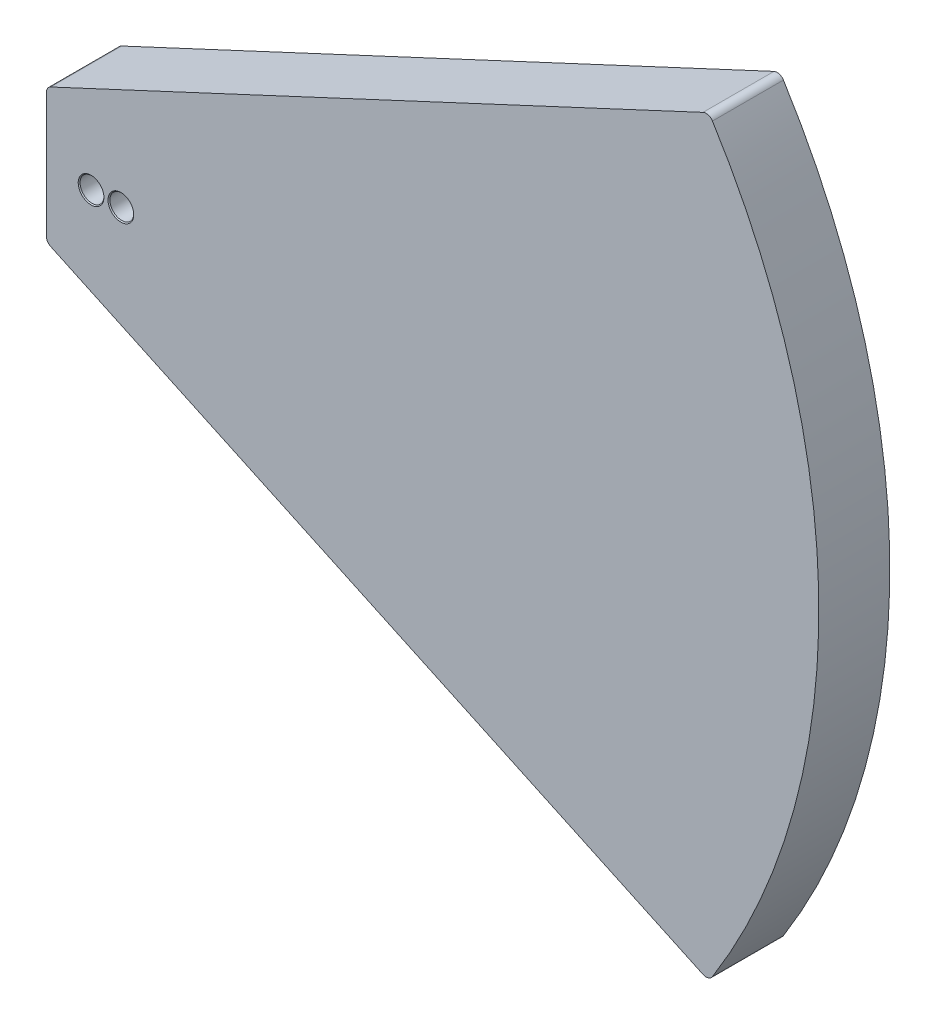
ISO-10303-21;
HEADER;
FILE_DESCRIPTION(('STEP AP214'),'2;1');
FILE_NAME('part.step','',(''),(''),'','','');
FILE_SCHEMA(('AUTOMOTIVE_DESIGN { 1 0 10303 214 1 1 1 1 }'));
ENDSEC;
DATA;
#1=APPLICATION_CONTEXT('core data for automotive mechanical design processes');
#2=APPLICATION_PROTOCOL_DEFINITION('international standard','automotive_design',2000,#1);
#3=PRODUCT_CONTEXT('',#1,'mechanical');
#4=PRODUCT('Part','Part','',(#3));
#5=PRODUCT_RELATED_PRODUCT_CATEGORY('part','',(#4));
#6=PRODUCT_DEFINITION_FORMATION('','',#4);
#7=PRODUCT_DEFINITION_CONTEXT('part definition',#1,'design');
#8=PRODUCT_DEFINITION('design','',#6,#7);
#9=PRODUCT_DEFINITION_SHAPE('','',#8);
#10=(LENGTH_UNIT() NAMED_UNIT(*) SI_UNIT(.MILLI.,.METRE.));
#11=(NAMED_UNIT(*) PLANE_ANGLE_UNIT() SI_UNIT($,.RADIAN.));
#12=(NAMED_UNIT(*) SI_UNIT($,.STERADIAN.) SOLID_ANGLE_UNIT());
#13=UNCERTAINTY_MEASURE_WITH_UNIT(LENGTH_MEASURE(1.E-05),#10,'distance_accuracy_value','');
#14=(GEOMETRIC_REPRESENTATION_CONTEXT(3) GLOBAL_UNCERTAINTY_ASSIGNED_CONTEXT((#13)) GLOBAL_UNIT_ASSIGNED_CONTEXT((#10,
#11,#12)) REPRESENTATION_CONTEXT('',''));
#15=CARTESIAN_POINT('',(0.,0.,0.));
#16=DIRECTION('',(0.,0.,1.));
#17=DIRECTION('',(1.,0.,0.));
#18=AXIS2_PLACEMENT_3D('',#15,#16,#17);
#19=CARTESIAN_POINT('',(0.,0.,0.));
#20=DIRECTION('',(0.,0.,1.));
#21=DIRECTION('',(1.,0.,0.));
#22=AXIS2_PLACEMENT_3D('',#19,#20,#21);
#23=PLANE('',#22);
#24=DIRECTION('',(0.,-1.,0.));
#25=VECTOR('',#24,1.);
#26=CARTESIAN_POINT('',(-10.,-9.,0.));
#27=LINE('',#26,#25);
#28=CARTESIAN_POINT('',(-10.,-5.5,0.));
#29=VERTEX_POINT('',#28);
#30=CARTESIAN_POINT('',(-10.,-8.36292973919251,0.));
#31=VERTEX_POINT('',#30);
#32=EDGE_CURVE('E198',#29,#31,#27,.T.);
#33=ORIENTED_EDGE('',*,*,#32,.F.);
#34=CARTESIAN_POINT('',(-9.,-5.5,0.));
#35=DIRECTION('',(0.,0.,1.));
#36=DIRECTION('',(1.,0.,0.));
#37=AXIS2_PLACEMENT_3D('',#34,#35,#36);
#38=CIRCLE('',#37,1.);
#39=CARTESIAN_POINT('',(-9.,-4.5,0.));
#40=VERTEX_POINT('',#39);
#41=EDGE_CURVE('E230',#29,#40,#38,.F.);
#42=ORIENTED_EDGE('',*,*,#41,.T.);
#43=DIRECTION('',(-1.,0.,0.));
#44=VECTOR('',#43,1.);
#45=CARTESIAN_POINT('',(0.,-4.5,0.));
#46=LINE('',#45,#44);
#47=CARTESIAN_POINT('',(0.,-4.5,0.));
#48=VERTEX_POINT('',#47);
#49=EDGE_CURVE('E150',#48,#40,#46,.T.);
#50=ORIENTED_EDGE('',*,*,#49,.F.);
#51=CARTESIAN_POINT('',(0.,0.,0.));
#52=DIRECTION('',(0.,0.,-1.));
#53=DIRECTION('',(-1.,0.,0.));
#54=AXIS2_PLACEMENT_3D('',#51,#52,#53);
#55=CIRCLE('',#54,4.5);
#56=CARTESIAN_POINT('',(0.,4.5,0.));
#57=VERTEX_POINT('',#56);
#58=EDGE_CURVE('E166',#57,#48,#55,.T.);
#59=ORIENTED_EDGE('',*,*,#58,.F.);
#60=DIRECTION('',(1.,0.,0.));
#61=VECTOR('',#60,1.);
#62=CARTESIAN_POINT('',(-10.,4.5,0.));
#63=LINE('',#62,#61);
#64=CARTESIAN_POINT('',(-9.,4.5,0.));
#65=VERTEX_POINT('',#64);
#66=EDGE_CURVE('E153',#65,#57,#63,.T.);
#67=ORIENTED_EDGE('',*,*,#66,.F.);
#68=CARTESIAN_POINT('',(-9.,5.5,0.));
#69=DIRECTION('',(0.,0.,1.));
#70=DIRECTION('',(1.,0.,0.));
#71=AXIS2_PLACEMENT_3D('',#68,#69,#70);
#72=CIRCLE('',#71,1.);
#73=CARTESIAN_POINT('',(-10.,5.5,0.));
#74=VERTEX_POINT('',#73);
#75=EDGE_CURVE('E218',#65,#74,#72,.F.);
#76=ORIENTED_EDGE('',*,*,#75,.T.);
#77=CARTESIAN_POINT('',(-10.,8.3629297391925,0.));
#78=VERTEX_POINT('',#77);
#79=EDGE_CURVE('E179',#78,#74,#27,.T.);
#80=ORIENTED_EDGE('',*,*,#79,.F.);
#81=CARTESIAN_POINT('',(-9.,8.3629297391925,0.));
#82=DIRECTION('',(0.,0.,1.));
#83=DIRECTION('',(1.,0.,0.));
#84=AXIS2_PLACEMENT_3D('',#81,#82,#83);
#85=CIRCLE('',#84,1.);
#86=CARTESIAN_POINT('',(-9.4226182617407,9.26923752622916,0.));
#87=VERTEX_POINT('',#86);
#88=EDGE_CURVE('E222',#78,#87,#85,.F.);
#89=ORIENTED_EDGE('',*,*,#88,.T.);
#90=DIRECTION('',(-0.906307787036649,-0.4226182617407,0.));
#91=VECTOR('',#90,1.);
#92=CARTESIAN_POINT('',(-10.,9.,0.));
#93=LINE('',#92,#91);
#94=CARTESIAN_POINT('',(78.1027823170481,50.0830020992024,0.));
#95=VERTEX_POINT('',#94);
#96=EDGE_CURVE('E192',#95,#87,#93,.T.);
#97=ORIENTED_EDGE('',*,*,#96,.F.);
#98=CARTESIAN_POINT('',(78.5254005787888,49.1766943121658,0.));
#99=DIRECTION('',(0.,0.,1.));
#100=DIRECTION('',(1.,0.,0.));
#101=AXIS2_PLACEMENT_3D('',#98,#99,#100);
#102=CIRCLE('',#101,1.);
#103=CARTESIAN_POINT('',(79.3729216172575,49.7074561131207,0.));
#104=VERTEX_POINT('',#103);
#105=EDGE_CURVE('E224',#95,#104,#102,.F.);
#106=ORIENTED_EDGE('',*,*,#105,.T.);
#107=CARTESIAN_POINT('',(0.,0.,0.));
#108=DIRECTION('',(0.,0.,1.));
#109=DIRECTION('',(1.,0.,0.));
#110=AXIS2_PLACEMENT_3D('',#107,#108,#109);
#111=CIRCLE('',#110,93.6530398828416);
#112=CARTESIAN_POINT('',(79.3729216172575,-49.7074561131207,0.));
#113=VERTEX_POINT('',#112);
#114=EDGE_CURVE('E191',#113,#104,#111,.T.);
#115=ORIENTED_EDGE('',*,*,#114,.F.);
#116=CARTESIAN_POINT('',(78.5254005787888,-49.1766943121658,0.));
#117=DIRECTION('',(0.,0.,1.));
#118=DIRECTION('',(1.,0.,0.));
#119=AXIS2_PLACEMENT_3D('',#116,#117,#118);
#120=CIRCLE('',#119,1.);
#121=CARTESIAN_POINT('',(78.1027823170481,-50.0830020992024,0.));
#122=VERTEX_POINT('',#121);
#123=EDGE_CURVE('E220',#113,#122,#120,.F.);
#124=ORIENTED_EDGE('',*,*,#123,.T.);
#125=DIRECTION('',(0.906307787036649,-0.4226182617407,0.));
#126=VECTOR('',#125,1.);
#127=CARTESIAN_POINT('',(-10.,-9.,0.));
#128=LINE('',#127,#126);
#129=CARTESIAN_POINT('',(-9.4226182617407,-9.26923752622916,0.));
#130=VERTEX_POINT('',#129);
#131=EDGE_CURVE('E174',#130,#122,#128,.T.);
#132=ORIENTED_EDGE('',*,*,#131,.F.);
#133=CARTESIAN_POINT('',(-9.,-8.36292973919251,0.));
#134=DIRECTION('',(0.,0.,1.));
#135=DIRECTION('',(1.,0.,0.));
#136=AXIS2_PLACEMENT_3D('',#133,#134,#135);
#137=CIRCLE('',#136,1.);
#138=EDGE_CURVE('E223',#130,#31,#137,.F.);
#139=ORIENTED_EDGE('',*,*,#138,.T.);
#140=EDGE_LOOP('',(#33,#42,#50,#59,#67,#76,#80,#89,#97,#106,#115,#124,#132,#139));
#141=FACE_BOUND('',#140,.T.);
#142=ADVANCED_FACE('F39',(#141),#23,.F.);
#143=CARTESIAN_POINT('',(-10.,-9.,9.525));
#144=DIRECTION('',(0.4226182617407,0.90630778703665,0.));
#145=DIRECTION('',(-0.906307787036649,0.4226182617407,0.));
#146=AXIS2_PLACEMENT_3D('',#143,#144,#145);
#147=PLANE('',#146);
#148=DIRECTION('',(0.906307787036649,-0.4226182617407,0.));
#149=VECTOR('',#148,1.);
#150=CARTESIAN_POINT('',(-10.,-9.,9.525));
#151=LINE('',#150,#149);
#152=CARTESIAN_POINT('',(-9.4226182617407,-9.26923752622916,9.525));
#153=VERTEX_POINT('',#152);
#154=CARTESIAN_POINT('',(78.1027823170481,-50.0830020992024,9.525));
#155=VERTEX_POINT('',#154);
#156=EDGE_CURVE('E176',#153,#155,#151,.T.);
#157=ORIENTED_EDGE('',*,*,#156,.F.);
#158=DIRECTION('',(0.,0.,-1.));
#159=VECTOR('',#158,1.);
#160=CARTESIAN_POINT('',(-9.4226182617407,-9.26923752622916,9.525));
#161=LINE('',#160,#159);
#162=EDGE_CURVE('E233',#153,#130,#161,.T.);
#163=ORIENTED_EDGE('',*,*,#162,.T.);
#164=ORIENTED_EDGE('',*,*,#131,.T.);
#165=DIRECTION('',(0.,0.,-1.));
#166=VECTOR('',#165,1.);
#167=CARTESIAN_POINT('',(78.1027823170481,-50.0830020992024,9.525));
#168=LINE('',#167,#166);
#169=EDGE_CURVE('E231',#122,#155,#168,.F.);
#170=ORIENTED_EDGE('',*,*,#169,.T.);
#171=EDGE_LOOP('',(#157,#163,#164,#170));
#172=FACE_BOUND('',#171,.T.);
#173=ADVANCED_FACE('F273',(#172),#147,.F.);
#174=CARTESIAN_POINT('',(0.,0.,9.525));
#175=DIRECTION('',(0.,0.,-1.));
#176=DIRECTION('',(-1.,0.,0.));
#177=AXIS2_PLACEMENT_3D('',#174,#175,#176);
#178=CYLINDRICAL_SURFACE('',#177,93.6530398828416);
#179=ORIENTED_EDGE('',*,*,#114,.T.);
#180=DIRECTION('',(0.,0.,-1.));
#181=VECTOR('',#180,1.);
#182=CARTESIAN_POINT('',(79.3729216172575,49.7074561131207,9.525));
#183=LINE('',#182,#181);
#184=CARTESIAN_POINT('',(79.3729216172575,49.7074561131207,9.525));
#185=VERTEX_POINT('',#184);
#186=EDGE_CURVE('E253',#104,#185,#183,.F.);
#187=ORIENTED_EDGE('',*,*,#186,.T.);
#188=CARTESIAN_POINT('',(0.,0.,9.525));
#189=DIRECTION('',(0.,0.,1.));
#190=DIRECTION('',(1.,0.,0.));
#191=AXIS2_PLACEMENT_3D('',#188,#189,#190);
#192=CIRCLE('',#191,93.6530398828416);
#193=CARTESIAN_POINT('',(79.3729216172575,-49.7074561131207,9.525));
#194=VERTEX_POINT('',#193);
#195=EDGE_CURVE('E177',#194,#185,#192,.T.);
#196=ORIENTED_EDGE('',*,*,#195,.F.);
#197=DIRECTION('',(0.,0.,-1.));
#198=VECTOR('',#197,1.);
#199=CARTESIAN_POINT('',(79.3729216172575,-49.7074561131207,9.525));
#200=LINE('',#199,#198);
#201=EDGE_CURVE('E248',#194,#113,#200,.T.);
#202=ORIENTED_EDGE('',*,*,#201,.T.);
#203=EDGE_LOOP('',(#179,#187,#196,#202));
#204=FACE_BOUND('',#203,.T.);
#205=ADVANCED_FACE('F284',(#204),#178,.T.);
#206=CARTESIAN_POINT('',(-10.,9.,9.525));
#207=DIRECTION('',(0.4226182617407,-0.90630778703665,0.));
#208=DIRECTION('',(0.906307787036649,0.4226182617407,0.));
#209=AXIS2_PLACEMENT_3D('',#206,#207,#208);
#210=PLANE('',#209);
#211=DIRECTION('',(-0.906307787036649,-0.4226182617407,0.));
#212=VECTOR('',#211,1.);
#213=CARTESIAN_POINT('',(-10.,9.,9.525));
#214=LINE('',#213,#212);
#215=CARTESIAN_POINT('',(78.1027823170481,50.0830020992024,9.525));
#216=VERTEX_POINT('',#215);
#217=CARTESIAN_POINT('',(-9.4226182617407,9.26923752622916,9.525));
#218=VERTEX_POINT('',#217);
#219=EDGE_CURVE('E181',#216,#218,#214,.T.);
#220=ORIENTED_EDGE('',*,*,#219,.F.);
#221=DIRECTION('',(0.,0.,-1.));
#222=VECTOR('',#221,1.);
#223=CARTESIAN_POINT('',(78.1027823170481,50.0830020992024,9.525));
#224=LINE('',#223,#222);
#225=EDGE_CURVE('E242',#216,#95,#224,.T.);
#226=ORIENTED_EDGE('',*,*,#225,.T.);
#227=ORIENTED_EDGE('',*,*,#96,.T.);
#228=DIRECTION('',(0.,0.,-1.));
#229=VECTOR('',#228,1.);
#230=CARTESIAN_POINT('',(-9.4226182617407,9.26923752622916,9.525));
#231=LINE('',#230,#229);
#232=EDGE_CURVE('E58',#87,#218,#231,.F.);
#233=ORIENTED_EDGE('',*,*,#232,.T.);
#234=EDGE_LOOP('',(#220,#226,#227,#233));
#235=FACE_BOUND('',#234,.T.);
#236=ADVANCED_FACE('F292',(#235),#210,.F.);
#237=CARTESIAN_POINT('',(-10.,-9.,9.525));
#238=DIRECTION('',(1.,0.,0.));
#239=DIRECTION('',(0.,0.,-1.));
#240=AXIS2_PLACEMENT_3D('',#237,#238,#239);
#241=PLANE('',#240);
#242=DIRECTION('',(0.,1.,0.));
#243=VECTOR('',#242,1.);
#244=CARTESIAN_POINT('',(-10.,4.5,4.));
#245=LINE('',#244,#243);
#246=CARTESIAN_POINT('',(-10.,-5.5,4.));
#247=VERTEX_POINT('',#246);
#248=CARTESIAN_POINT('',(-10.,5.5,4.));
#249=VERTEX_POINT('',#248);
#250=EDGE_CURVE('E158',#247,#249,#245,.T.);
#251=ORIENTED_EDGE('',*,*,#250,.F.);
#252=DIRECTION('',(0.,0.,-1.));
#253=VECTOR('',#252,1.);
#254=CARTESIAN_POINT('',(-10.,-5.5,9.525));
#255=LINE('',#254,#253);
#256=EDGE_CURVE('E212',#247,#29,#255,.T.);
#257=ORIENTED_EDGE('',*,*,#256,.T.);
#258=ORIENTED_EDGE('',*,*,#32,.T.);
#259=DIRECTION('',(0.,0.,-1.));
#260=VECTOR('',#259,1.);
#261=CARTESIAN_POINT('',(-10.,-8.36292973919251,9.525));
#262=LINE('',#261,#260);
#263=CARTESIAN_POINT('',(-10.,-8.36292973919251,9.525));
#264=VERTEX_POINT('',#263);
#265=EDGE_CURVE('E215',#31,#264,#262,.F.);
#266=ORIENTED_EDGE('',*,*,#265,.T.);
#267=DIRECTION('',(0.,-1.,0.));
#268=VECTOR('',#267,1.);
#269=CARTESIAN_POINT('',(-10.,-9.,9.525));
#270=LINE('',#269,#268);
#271=CARTESIAN_POINT('',(-10.,8.3629297391925,9.525));
#272=VERTEX_POINT('',#271);
#273=EDGE_CURVE('E183',#272,#264,#270,.T.);
#274=ORIENTED_EDGE('',*,*,#273,.F.);
#275=DIRECTION('',(0.,0.,-1.));
#276=VECTOR('',#275,1.);
#277=CARTESIAN_POINT('',(-10.,8.3629297391925,9.525));
#278=LINE('',#277,#276);
#279=EDGE_CURVE('E207',#272,#78,#278,.T.);
#280=ORIENTED_EDGE('',*,*,#279,.T.);
#281=ORIENTED_EDGE('',*,*,#79,.T.);
#282=DIRECTION('',(0.,0.,-1.));
#283=VECTOR('',#282,1.);
#284=CARTESIAN_POINT('',(-10.,5.5,9.525));
#285=LINE('',#284,#283);
#286=EDGE_CURVE('E186',#74,#249,#285,.F.);
#287=ORIENTED_EDGE('',*,*,#286,.T.);
#288=EDGE_LOOP('',(#251,#257,#258,#266,#274,#280,#281,#287));
#289=FACE_BOUND('',#288,.T.);
#290=ADVANCED_FACE('F263',(#289),#241,.F.);
#291=CARTESIAN_POINT('',(0.,0.,9.525));
#292=DIRECTION('',(0.,0.,1.));
#293=DIRECTION('',(1.,0.,0.));
#294=AXIS2_PLACEMENT_3D('',#291,#292,#293);
#295=PLANE('',#294);
#296=CARTESIAN_POINT('',(0.,0.,9.525));
#297=DIRECTION('',(0.,0.,1.));
#298=DIRECTION('',(1.,0.,0.));
#299=AXIS2_PLACEMENT_3D('',#296,#297,#298);
#300=CIRCLE('',#299,1.725);
#301=CARTESIAN_POINT('',(1.725,0.,9.525));
#302=VERTEX_POINT('',#301);
#303=EDGE_CURVE('E467',#302,#302,#300,.T.);
#304=ORIENTED_EDGE('',*,*,#303,.F.);
#305=EDGE_LOOP('',(#304));
#306=FACE_BOUND('',#305,.T.);
#307=CARTESIAN_POINT('',(-4.,0.,9.525));
#308=DIRECTION('',(0.,0.,1.));
#309=DIRECTION('',(1.,0.,0.));
#310=AXIS2_PLACEMENT_3D('',#307,#308,#309);
#311=CIRCLE('',#310,1.725);
#312=CARTESIAN_POINT('',(-2.275,0.,9.525));
#313=VERTEX_POINT('',#312);
#314=EDGE_CURVE('E202',#313,#313,#311,.T.);
#315=ORIENTED_EDGE('',*,*,#314,.F.);
#316=EDGE_LOOP('',(#315));
#317=FACE_BOUND('',#316,.T.);
#318=ORIENTED_EDGE('',*,*,#273,.T.);
#319=CARTESIAN_POINT('',(-9.,-8.36292973919251,9.525));
#320=DIRECTION('',(0.,0.,1.));
#321=DIRECTION('',(1.,0.,0.));
#322=AXIS2_PLACEMENT_3D('',#319,#320,#321);
#323=CIRCLE('',#322,1.);
#324=EDGE_CURVE('E245',#264,#153,#323,.T.);
#325=ORIENTED_EDGE('',*,*,#324,.T.);
#326=ORIENTED_EDGE('',*,*,#156,.T.);
#327=CARTESIAN_POINT('',(78.5254005787888,-49.1766943121658,9.525));
#328=DIRECTION('',(0.,0.,1.));
#329=DIRECTION('',(1.,0.,0.));
#330=AXIS2_PLACEMENT_3D('',#327,#328,#329);
#331=CIRCLE('',#330,1.);
#332=EDGE_CURVE('E237',#155,#194,#331,.T.);
#333=ORIENTED_EDGE('',*,*,#332,.T.);
#334=ORIENTED_EDGE('',*,*,#195,.T.);
#335=CARTESIAN_POINT('',(78.5254005787888,49.1766943121658,9.525));
#336=DIRECTION('',(0.,0.,1.));
#337=DIRECTION('',(1.,0.,0.));
#338=AXIS2_PLACEMENT_3D('',#335,#336,#337);
#339=CIRCLE('',#338,1.);
#340=EDGE_CURVE('E238',#185,#216,#339,.T.);
#341=ORIENTED_EDGE('',*,*,#340,.T.);
#342=ORIENTED_EDGE('',*,*,#219,.T.);
#343=CARTESIAN_POINT('',(-9.,8.3629297391925,9.525));
#344=DIRECTION('',(0.,0.,1.));
#345=DIRECTION('',(1.,0.,0.));
#346=AXIS2_PLACEMENT_3D('',#343,#344,#345);
#347=CIRCLE('',#346,1.);
#348=EDGE_CURVE('E236',#218,#272,#347,.T.);
#349=ORIENTED_EDGE('',*,*,#348,.T.);
#350=EDGE_LOOP('',(#318,#325,#326,#333,#334,#341,#342,#349));
#351=FACE_BOUND('',#350,.T.);
#352=ADVANCED_FACE('F279',(#306,#317,#351),#295,.T.);
#353=CARTESIAN_POINT('',(-10.,4.5,4.));
#354=DIRECTION('',(0.,1.,0.));
#355=DIRECTION('',(0.,0.,1.));
#356=AXIS2_PLACEMENT_3D('',#353,#354,#355);
#357=PLANE('',#356);
#358=DIRECTION('',(1.,0.,0.));
#359=VECTOR('',#358,1.);
#360=CARTESIAN_POINT('',(-10.,4.5,4.));
#361=LINE('',#360,#359);
#362=CARTESIAN_POINT('',(-9.,4.5,4.));
#363=VERTEX_POINT('',#362);
#364=CARTESIAN_POINT('',(0.,4.5,4.));
#365=VERTEX_POINT('',#364);
#366=EDGE_CURVE('E138',#363,#365,#361,.T.);
#367=ORIENTED_EDGE('',*,*,#366,.F.);
#368=DIRECTION('',(0.,0.,-1.));
#369=VECTOR('',#368,1.);
#370=CARTESIAN_POINT('',(-9.,4.5,4.));
#371=LINE('',#370,#369);
#372=EDGE_CURVE('E251',#363,#65,#371,.T.);
#373=ORIENTED_EDGE('',*,*,#372,.T.);
#374=ORIENTED_EDGE('',*,*,#66,.T.);
#375=DIRECTION('',(0.,0.,-1.));
#376=VECTOR('',#375,1.);
#377=CARTESIAN_POINT('',(0.,4.5,4.));
#378=LINE('',#377,#376);
#379=EDGE_CURVE('E147',#365,#57,#378,.T.);
#380=ORIENTED_EDGE('',*,*,#379,.F.);
#381=EDGE_LOOP('',(#367,#373,#374,#380));
#382=FACE_BOUND('',#381,.T.);
#383=ADVANCED_FACE('F151',(#382),#357,.F.);
#384=CARTESIAN_POINT('',(0.,-4.5,4.));
#385=DIRECTION('',(0.,-1.,0.));
#386=DIRECTION('',(0.,0.,-1.));
#387=AXIS2_PLACEMENT_3D('',#384,#385,#386);
#388=PLANE('',#387);
#389=ORIENTED_EDGE('',*,*,#49,.T.);
#390=DIRECTION('',(0.,0.,-1.));
#391=VECTOR('',#390,1.);
#392=CARTESIAN_POINT('',(-9.,-4.5,4.));
#393=LINE('',#392,#391);
#394=CARTESIAN_POINT('',(-9.,-4.5,4.));
#395=VERTEX_POINT('',#394);
#396=EDGE_CURVE('E229',#40,#395,#393,.F.);
#397=ORIENTED_EDGE('',*,*,#396,.T.);
#398=DIRECTION('',(-1.,0.,0.));
#399=VECTOR('',#398,1.);
#400=CARTESIAN_POINT('',(0.,-4.5,4.));
#401=LINE('',#400,#399);
#402=CARTESIAN_POINT('',(0.,-4.5,4.));
#403=VERTEX_POINT('',#402);
#404=EDGE_CURVE('E165',#403,#395,#401,.T.);
#405=ORIENTED_EDGE('',*,*,#404,.F.);
#406=DIRECTION('',(0.,0.,-1.));
#407=VECTOR('',#406,1.);
#408=CARTESIAN_POINT('',(0.,-4.5,4.));
#409=LINE('',#408,#407);
#410=EDGE_CURVE('E160',#403,#48,#409,.T.);
#411=ORIENTED_EDGE('',*,*,#410,.T.);
#412=EDGE_LOOP('',(#389,#397,#405,#411));
#413=FACE_BOUND('',#412,.T.);
#414=ADVANCED_FACE('F409',(#413),#388,.F.);
#415=CARTESIAN_POINT('',(0.,0.,4.));
#416=DIRECTION('',(0.,0.,-1.));
#417=DIRECTION('',(-1.,0.,0.));
#418=AXIS2_PLACEMENT_3D('',#415,#416,#417);
#419=CYLINDRICAL_SURFACE('',#418,4.5);
#420=ORIENTED_EDGE('',*,*,#58,.T.);
#421=ORIENTED_EDGE('',*,*,#410,.F.);
#422=CARTESIAN_POINT('',(0.,0.,4.));
#423=DIRECTION('',(0.,0.,-1.));
#424=DIRECTION('',(-1.,0.,0.));
#425=AXIS2_PLACEMENT_3D('',#422,#423,#424);
#426=CIRCLE('',#425,4.5);
#427=EDGE_CURVE('E141',#365,#403,#426,.T.);
#428=ORIENTED_EDGE('',*,*,#427,.F.);
#429=ORIENTED_EDGE('',*,*,#379,.T.);
#430=EDGE_LOOP('',(#420,#421,#428,#429));
#431=FACE_BOUND('',#430,.T.);
#432=ADVANCED_FACE('F159',(#431),#419,.F.);
#433=CARTESIAN_POINT('',(0.,0.,4.));
#434=DIRECTION('',(0.,0.,-1.));
#435=DIRECTION('',(-1.,0.,0.));
#436=AXIS2_PLACEMENT_3D('',#433,#434,#435);
#437=PLANE('',#436);
#438=CARTESIAN_POINT('',(0.,0.,4.));
#439=DIRECTION('',(0.,0.,-1.));
#440=DIRECTION('',(-1.,0.,0.));
#441=AXIS2_PLACEMENT_3D('',#438,#439,#440);
#442=CIRCLE('',#441,1.6);
#443=CARTESIAN_POINT('',(-1.6,0.,4.));
#444=VERTEX_POINT('',#443);
#445=EDGE_CURVE('E205',#444,#444,#442,.T.);
#446=ORIENTED_EDGE('',*,*,#445,.F.);
#447=EDGE_LOOP('',(#446));
#448=FACE_BOUND('',#447,.T.);
#449=CARTESIAN_POINT('',(-4.,0.,4.));
#450=DIRECTION('',(0.,0.,-1.));
#451=DIRECTION('',(-1.,0.,0.));
#452=AXIS2_PLACEMENT_3D('',#449,#450,#451);
#453=CIRCLE('',#452,1.6);
#454=CARTESIAN_POINT('',(-5.6,0.,4.));
#455=VERTEX_POINT('',#454);
#456=EDGE_CURVE('E168',#455,#455,#453,.T.);
#457=ORIENTED_EDGE('',*,*,#456,.F.);
#458=EDGE_LOOP('',(#457));
#459=FACE_BOUND('',#458,.T.);
#460=ORIENTED_EDGE('',*,*,#250,.T.);
#461=CARTESIAN_POINT('',(-9.,5.5,4.));
#462=DIRECTION('',(0.,0.,-1.));
#463=DIRECTION('',(-1.,0.,0.));
#464=AXIS2_PLACEMENT_3D('',#461,#462,#463);
#465=CIRCLE('',#464,1.);
#466=EDGE_CURVE('E11',#249,#363,#465,.F.);
#467=ORIENTED_EDGE('',*,*,#466,.T.);
#468=ORIENTED_EDGE('',*,*,#366,.T.);
#469=ORIENTED_EDGE('',*,*,#427,.T.);
#470=ORIENTED_EDGE('',*,*,#404,.T.);
#471=CARTESIAN_POINT('',(-9.,-5.5,4.));
#472=DIRECTION('',(0.,0.,-1.));
#473=DIRECTION('',(-1.,0.,0.));
#474=AXIS2_PLACEMENT_3D('',#471,#472,#473);
#475=CIRCLE('',#474,1.);
#476=EDGE_CURVE('E50',#395,#247,#475,.F.);
#477=ORIENTED_EDGE('',*,*,#476,.T.);
#478=EDGE_LOOP('',(#460,#467,#468,#469,#470,#477));
#479=FACE_BOUND('',#478,.T.);
#480=ADVANCED_FACE('F139',(#448,#459,#479),#437,.T.);
#481=CARTESIAN_POINT('',(-4.,0.,9.525));
#482=DIRECTION('',(0.,0.,1.));
#483=DIRECTION('',(1.,0.,0.));
#484=AXIS2_PLACEMENT_3D('',#481,#482,#483);
#485=CYLINDRICAL_SURFACE('',#484,1.6);
#486=ORIENTED_EDGE('',*,*,#456,.T.);
#487=EDGE_LOOP('',(#486));
#488=FACE_BOUND('',#487,.T.);
#489=CARTESIAN_POINT('',(-4.,0.,9.4));
#490=DIRECTION('',(0.,0.,1.));
#491=DIRECTION('',(1.,0.,0.));
#492=AXIS2_PLACEMENT_3D('',#489,#490,#491);
#493=CIRCLE('',#492,1.6);
#494=CARTESIAN_POINT('',(-2.4,0.,9.4));
#495=VERTEX_POINT('',#494);
#496=EDGE_CURVE('E203',#495,#495,#493,.T.);
#497=ORIENTED_EDGE('',*,*,#496,.T.);
#498=EDGE_LOOP('',(#497));
#499=FACE_BOUND('',#498,.T.);
#500=ADVANCED_FACE('F383',(#488,#499),#485,.F.);
#501=CARTESIAN_POINT('',(-4.,0.,9.525));
#502=DIRECTION('',(0.,0.,1.));
#503=DIRECTION('',(1.,0.,0.));
#504=AXIS2_PLACEMENT_3D('',#501,#502,#503);
#505=CONICAL_SURFACE('',#504,1.725,0.785398163397452);
#506=ORIENTED_EDGE('',*,*,#496,.F.);
#507=EDGE_LOOP('',(#506));
#508=FACE_BOUND('',#507,.T.);
#509=ORIENTED_EDGE('',*,*,#314,.T.);
#510=EDGE_LOOP('',(#509));
#511=FACE_BOUND('',#510,.T.);
#512=ADVANCED_FACE('F374',(#508,#511),#505,.F.);
#513=CARTESIAN_POINT('',(0.,0.,9.525));
#514=DIRECTION('',(0.,0.,1.));
#515=DIRECTION('',(1.,0.,0.));
#516=AXIS2_PLACEMENT_3D('',#513,#514,#515);
#517=CYLINDRICAL_SURFACE('',#516,1.6);
#518=ORIENTED_EDGE('',*,*,#445,.T.);
#519=EDGE_LOOP('',(#518));
#520=FACE_BOUND('',#519,.T.);
#521=CARTESIAN_POINT('',(0.,0.,9.4));
#522=DIRECTION('',(0.,0.,1.));
#523=DIRECTION('',(1.,0.,0.));
#524=AXIS2_PLACEMENT_3D('',#521,#522,#523);
#525=CIRCLE('',#524,1.6);
#526=CARTESIAN_POINT('',(1.6,0.,9.4));
#527=VERTEX_POINT('',#526);
#528=EDGE_CURVE('E206',#527,#527,#525,.T.);
#529=ORIENTED_EDGE('',*,*,#528,.T.);
#530=EDGE_LOOP('',(#529));
#531=FACE_BOUND('',#530,.T.);
#532=ADVANCED_FACE('F368',(#520,#531),#517,.F.);
#533=CARTESIAN_POINT('',(0.,0.,9.525));
#534=DIRECTION('',(0.,0.,1.));
#535=DIRECTION('',(1.,0.,0.));
#536=AXIS2_PLACEMENT_3D('',#533,#534,#535);
#537=CONICAL_SURFACE('',#536,1.725,0.785398163397453);
#538=ORIENTED_EDGE('',*,*,#528,.F.);
#539=EDGE_LOOP('',(#538));
#540=FACE_BOUND('',#539,.T.);
#541=ORIENTED_EDGE('',*,*,#303,.T.);
#542=EDGE_LOOP('',(#541));
#543=FACE_BOUND('',#542,.T.);
#544=ADVANCED_FACE('F324',(#540,#543),#537,.F.);
#545=CARTESIAN_POINT('',(-9.,-5.5,9.525));
#546=DIRECTION('',(0.,0.,-1.));
#547=DIRECTION('',(-1.,0.,0.));
#548=AXIS2_PLACEMENT_3D('',#545,#546,#547);
#549=CYLINDRICAL_SURFACE('',#548,1.);
#550=ORIENTED_EDGE('',*,*,#476,.F.);
#551=ORIENTED_EDGE('',*,*,#396,.F.);
#552=ORIENTED_EDGE('',*,*,#41,.F.);
#553=ORIENTED_EDGE('',*,*,#256,.F.);
#554=EDGE_LOOP('',(#550,#551,#552,#553));
#555=FACE_BOUND('',#554,.T.);
#556=ADVANCED_FACE('F259',(#555),#549,.T.);
#557=CARTESIAN_POINT('',(-9.,-8.36292973919251,9.525));
#558=DIRECTION('',(0.,0.,-1.));
#559=DIRECTION('',(-1.,0.,0.));
#560=AXIS2_PLACEMENT_3D('',#557,#558,#559);
#561=CYLINDRICAL_SURFACE('',#560,1.);
#562=ORIENTED_EDGE('',*,*,#324,.F.);
#563=ORIENTED_EDGE('',*,*,#265,.F.);
#564=ORIENTED_EDGE('',*,*,#138,.F.);
#565=ORIENTED_EDGE('',*,*,#162,.F.);
#566=EDGE_LOOP('',(#562,#563,#564,#565));
#567=FACE_BOUND('',#566,.T.);
#568=ADVANCED_FACE('F271',(#567),#561,.T.);
#569=CARTESIAN_POINT('',(78.5254005787888,49.1766943121658,9.525));
#570=DIRECTION('',(0.,0.,-1.));
#571=DIRECTION('',(-1.,0.,0.));
#572=AXIS2_PLACEMENT_3D('',#569,#570,#571);
#573=CYLINDRICAL_SURFACE('',#572,1.);
#574=ORIENTED_EDGE('',*,*,#340,.F.);
#575=ORIENTED_EDGE('',*,*,#186,.F.);
#576=ORIENTED_EDGE('',*,*,#105,.F.);
#577=ORIENTED_EDGE('',*,*,#225,.F.);
#578=EDGE_LOOP('',(#574,#575,#576,#577));
#579=FACE_BOUND('',#578,.T.);
#580=ADVANCED_FACE('F289',(#579),#573,.T.);
#581=CARTESIAN_POINT('',(-9.,8.3629297391925,9.525));
#582=DIRECTION('',(0.,0.,-1.));
#583=DIRECTION('',(-1.,0.,0.));
#584=AXIS2_PLACEMENT_3D('',#581,#582,#583);
#585=CYLINDRICAL_SURFACE('',#584,1.);
#586=ORIENTED_EDGE('',*,*,#348,.F.);
#587=ORIENTED_EDGE('',*,*,#232,.F.);
#588=ORIENTED_EDGE('',*,*,#88,.F.);
#589=ORIENTED_EDGE('',*,*,#279,.F.);
#590=EDGE_LOOP('',(#586,#587,#588,#589));
#591=FACE_BOUND('',#590,.T.);
#592=ADVANCED_FACE('F298',(#591),#585,.T.);
#593=CARTESIAN_POINT('',(-9.,5.5,4.));
#594=DIRECTION('',(0.,0.,-1.));
#595=DIRECTION('',(-1.,0.,0.));
#596=AXIS2_PLACEMENT_3D('',#593,#594,#595);
#597=CYLINDRICAL_SURFACE('',#596,1.);
#598=ORIENTED_EDGE('',*,*,#466,.F.);
#599=ORIENTED_EDGE('',*,*,#286,.F.);
#600=ORIENTED_EDGE('',*,*,#75,.F.);
#601=ORIENTED_EDGE('',*,*,#372,.F.);
#602=EDGE_LOOP('',(#598,#599,#600,#601));
#603=FACE_BOUND('',#602,.T.);
#604=ADVANCED_FACE('F297',(#603),#597,.T.);
#605=CARTESIAN_POINT('',(78.5254005787888,-49.1766943121658,9.525));
#606=DIRECTION('',(0.,0.,-1.));
#607=DIRECTION('',(-1.,0.,0.));
#608=AXIS2_PLACEMENT_3D('',#605,#606,#607);
#609=CYLINDRICAL_SURFACE('',#608,1.);
#610=ORIENTED_EDGE('',*,*,#332,.F.);
#611=ORIENTED_EDGE('',*,*,#169,.F.);
#612=ORIENTED_EDGE('',*,*,#123,.F.);
#613=ORIENTED_EDGE('',*,*,#201,.F.);
#614=EDGE_LOOP('',(#610,#611,#612,#613));
#615=FACE_BOUND('',#614,.T.);
#616=ADVANCED_FACE('F41',(#615),#609,.T.);
#617=CLOSED_SHELL('',(#142,#173,#205,#236,#290,#352,#383,#414,#432,#480,#500,#512,#532,#544,
#556,#568,#580,#592,#604,#616));
#618=MANIFOLD_SOLID_BREP('B2',#617);
#619=ADVANCED_BREP_SHAPE_REPRESENTATION('',(#18,#618),#14);
#620=SHAPE_DEFINITION_REPRESENTATION(#9,#619);
ENDSEC;
END-ISO-10303-21;
